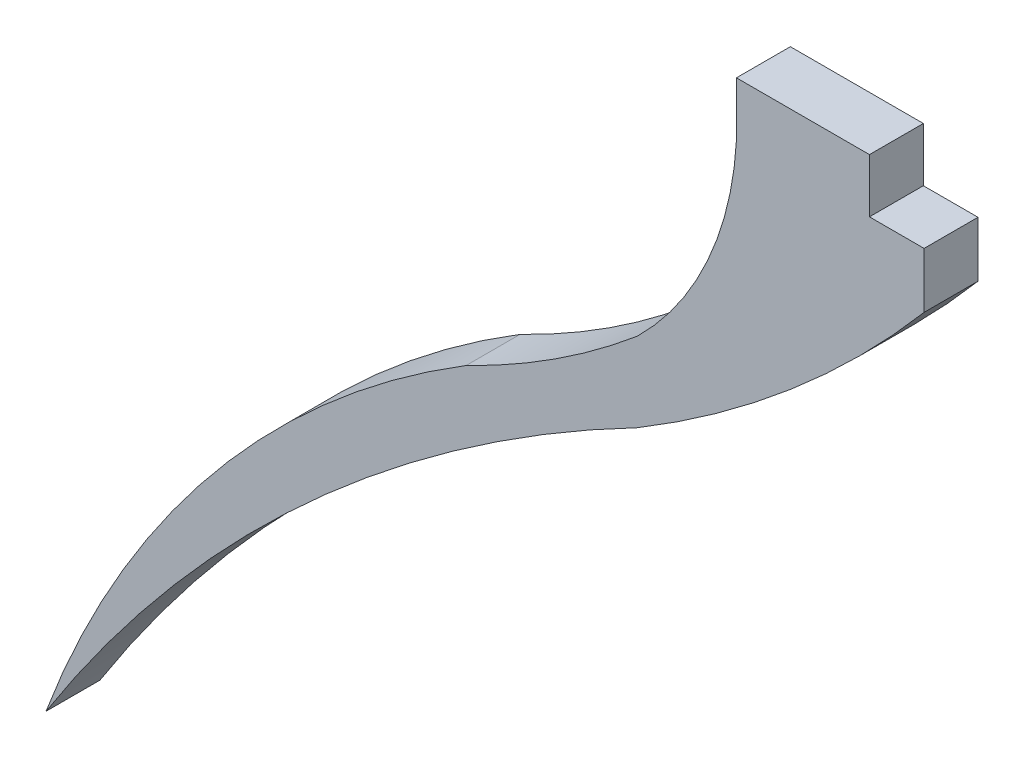
ISO-10303-21;
HEADER;
FILE_DESCRIPTION(('STEP AP214'),'2;1');
FILE_NAME('part.step','',(''),(''),'','','');
FILE_SCHEMA(('AUTOMOTIVE_DESIGN { 1 0 10303 214 1 1 1 1 }'));
ENDSEC;
DATA;
#1=APPLICATION_CONTEXT('core data for automotive mechanical design processes');
#2=APPLICATION_PROTOCOL_DEFINITION('international standard','automotive_design',2000,#1);
#3=PRODUCT_CONTEXT('',#1,'mechanical');
#4=PRODUCT('Part','Part','',(#3));
#5=PRODUCT_RELATED_PRODUCT_CATEGORY('part','',(#4));
#6=PRODUCT_DEFINITION_FORMATION('','',#4);
#7=PRODUCT_DEFINITION_CONTEXT('part definition',#1,'design');
#8=PRODUCT_DEFINITION('design','',#6,#7);
#9=PRODUCT_DEFINITION_SHAPE('','',#8);
#10=(LENGTH_UNIT() NAMED_UNIT(*) SI_UNIT(.MILLI.,.METRE.));
#11=(NAMED_UNIT(*) PLANE_ANGLE_UNIT() SI_UNIT($,.RADIAN.));
#12=(NAMED_UNIT(*) SI_UNIT($,.STERADIAN.) SOLID_ANGLE_UNIT());
#13=UNCERTAINTY_MEASURE_WITH_UNIT(LENGTH_MEASURE(1.E-05),#10,'distance_accuracy_value','');
#14=(GEOMETRIC_REPRESENTATION_CONTEXT(3) GLOBAL_UNCERTAINTY_ASSIGNED_CONTEXT((#13)) GLOBAL_UNIT_ASSIGNED_CONTEXT((#10,
#11,#12)) REPRESENTATION_CONTEXT('',''));
#15=CARTESIAN_POINT('',(0.,0.,0.));
#16=DIRECTION('',(0.,0.,1.));
#17=DIRECTION('',(1.,0.,0.));
#18=AXIS2_PLACEMENT_3D('',#15,#16,#17);
#19=CARTESIAN_POINT('',(-2.25203372430503,1.524,1.524));
#20=DIRECTION('',(0.,-1.,0.));
#21=DIRECTION('',(1.,0.,0.));
#22=AXIS2_PLACEMENT_3D('',#19,#20,#21);
#23=PLANE('',#22);
#24=DIRECTION('',(-1.,0.,0.));
#25=VECTOR('',#24,1.);
#26=CARTESIAN_POINT('',(-2.25203372430503,1.524,0.));
#27=LINE('',#26,#25);
#28=CARTESIAN_POINT('',(1.50795984157009,1.524,0.));
#29=VERTEX_POINT('',#28);
#30=CARTESIAN_POINT('',(-2.25203372430503,1.524,0.));
#31=VERTEX_POINT('',#30);
#32=EDGE_CURVE('E140',#29,#31,#27,.T.);
#33=ORIENTED_EDGE('',*,*,#32,.T.);
#34=DIRECTION('',(0.,0.,-1.));
#35=VECTOR('',#34,1.);
#36=CARTESIAN_POINT('',(-2.25203372430503,1.524,1.524));
#37=LINE('',#36,#35);
#38=CARTESIAN_POINT('',(-2.25203372430503,1.524,1.524));
#39=VERTEX_POINT('',#38);
#40=EDGE_CURVE('E11',#39,#31,#37,.T.);
#41=ORIENTED_EDGE('',*,*,#40,.F.);
#42=DIRECTION('',(-1.,0.,0.));
#43=VECTOR('',#42,1.);
#44=CARTESIAN_POINT('',(-2.25203372430503,1.524,1.524));
#45=LINE('',#44,#43);
#46=CARTESIAN_POINT('',(1.50795984157009,1.524,1.524));
#47=VERTEX_POINT('',#46);
#48=EDGE_CURVE('E158',#47,#39,#45,.T.);
#49=ORIENTED_EDGE('',*,*,#48,.F.);
#50=DIRECTION('',(0.,0.,-1.));
#51=VECTOR('',#50,1.);
#52=CARTESIAN_POINT('',(1.50795984157009,1.524,1.524));
#53=LINE('',#52,#51);
#54=EDGE_CURVE('E136',#47,#29,#53,.T.);
#55=ORIENTED_EDGE('',*,*,#54,.T.);
#56=EDGE_LOOP('',(#33,#41,#49,#55));
#57=FACE_BOUND('',#56,.T.);
#58=ADVANCED_FACE('F32',(#57),#23,.F.);
#59=CARTESIAN_POINT('',(-2.25203372430503,0.,1.524));
#60=DIRECTION('',(1.,0.,0.));
#61=DIRECTION('',(0.,1.,0.));
#62=AXIS2_PLACEMENT_3D('',#59,#60,#61);
#63=PLANE('',#62);
#64=DIRECTION('',(0.,-1.,0.));
#65=VECTOR('',#64,1.);
#66=CARTESIAN_POINT('',(-2.25203372430503,0.,0.));
#67=LINE('',#66,#65);
#68=CARTESIAN_POINT('',(-2.25203372430502,0.,0.));
#69=VERTEX_POINT('',#68);
#70=EDGE_CURVE('E143',#31,#69,#67,.T.);
#71=ORIENTED_EDGE('',*,*,#70,.T.);
#72=DIRECTION('',(0.,0.,-1.));
#73=VECTOR('',#72,1.);
#74=CARTESIAN_POINT('',(-2.25203372430502,0.,1.524));
#75=LINE('',#74,#73);
#76=CARTESIAN_POINT('',(-2.25203372430502,0.,1.524));
#77=VERTEX_POINT('',#76);
#78=EDGE_CURVE('E40',#77,#69,#75,.T.);
#79=ORIENTED_EDGE('',*,*,#78,.F.);
#80=DIRECTION('',(0.,-1.,0.));
#81=VECTOR('',#80,1.);
#82=CARTESIAN_POINT('',(-2.25203372430503,0.,1.524));
#83=LINE('',#82,#81);
#84=EDGE_CURVE('E97',#39,#77,#83,.T.);
#85=ORIENTED_EDGE('',*,*,#84,.F.);
#86=ORIENTED_EDGE('',*,*,#40,.T.);
#87=EDGE_LOOP('',(#71,#79,#85,#86));
#88=FACE_BOUND('',#87,.T.);
#89=ADVANCED_FACE('F207',(#88),#63,.F.);
#90=CARTESIAN_POINT('',(-11.6297715684799,0.501945387016467,1.524));
#91=DIRECTION('',(0.,0.,-1.));
#92=DIRECTION('',(-1.,0.,0.));
#93=AXIS2_PLACEMENT_3D('',#90,#91,#92);
#94=CYLINDRICAL_SURFACE('',#93,9.39116160257166);
#95=CARTESIAN_POINT('',(-11.6297715684799,0.501945387016467,0.));
#96=DIRECTION('',(0.,0.,-1.));
#97=DIRECTION('',(-1.,0.,0.));
#98=AXIS2_PLACEMENT_3D('',#95,#96,#97);
#99=CIRCLE('',#98,9.39116160257166);
#100=CARTESIAN_POINT('',(-5.05366894226105,-6.20244052781974,0.));
#101=VERTEX_POINT('',#100);
#102=EDGE_CURVE('E145',#69,#101,#99,.T.);
#103=ORIENTED_EDGE('',*,*,#102,.T.);
#104=DIRECTION('',(0.,0.,-1.));
#105=VECTOR('',#104,1.);
#106=CARTESIAN_POINT('',(-5.05366894226105,-6.20244052781974,1.524));
#107=LINE('',#106,#105);
#108=CARTESIAN_POINT('',(-5.05366894226105,-6.20244052781974,1.524));
#109=VERTEX_POINT('',#108);
#110=EDGE_CURVE('E171',#109,#101,#107,.T.);
#111=ORIENTED_EDGE('',*,*,#110,.F.);
#112=CARTESIAN_POINT('',(-11.6297715684799,0.501945387016467,1.524));
#113=DIRECTION('',(0.,0.,-1.));
#114=DIRECTION('',(-1.,0.,0.));
#115=AXIS2_PLACEMENT_3D('',#112,#113,#114);
#116=CIRCLE('',#115,9.39116160257166);
#117=EDGE_CURVE('E179',#77,#109,#116,.T.);
#118=ORIENTED_EDGE('',*,*,#117,.F.);
#119=ORIENTED_EDGE('',*,*,#78,.T.);
#120=EDGE_LOOP('',(#103,#111,#118,#119));
#121=FACE_BOUND('',#120,.T.);
#122=ADVANCED_FACE('F177',(#121),#94,.F.);
#123=CARTESIAN_POINT('',(-20.0848571945167,11.6812478956144,1.524));
#124=DIRECTION('',(0.,0.,-1.));
#125=DIRECTION('',(-1.,0.,0.));
#126=AXIS2_PLACEMENT_3D('',#123,#124,#125);
#127=CYLINDRICAL_SURFACE('',#126,23.3615695513213);
#128=CARTESIAN_POINT('',(-20.0848571945167,11.6812478956144,0.));
#129=DIRECTION('',(0.,0.,-1.));
#130=DIRECTION('',(1.,0.,0.));
#131=AXIS2_PLACEMENT_3D('',#128,#129,#130);
#132=CIRCLE('',#131,23.3615695513213);
#133=CARTESIAN_POINT('',(-9.89443503963535,-9.3406033122722,0.));
#134=VERTEX_POINT('',#133);
#135=EDGE_CURVE('E147',#101,#134,#132,.T.);
#136=ORIENTED_EDGE('',*,*,#135,.T.);
#137=DIRECTION('',(0.,0.,-1.));
#138=VECTOR('',#137,1.);
#139=CARTESIAN_POINT('',(-9.89443503963535,-9.3406033122722,1.524));
#140=LINE('',#139,#138);
#141=CARTESIAN_POINT('',(-9.89443503963535,-9.3406033122722,1.524));
#142=VERTEX_POINT('',#141);
#143=EDGE_CURVE('E168',#142,#134,#140,.T.);
#144=ORIENTED_EDGE('',*,*,#143,.F.);
#145=CARTESIAN_POINT('',(-20.0848571945167,11.6812478956144,1.524));
#146=DIRECTION('',(0.,0.,-1.));
#147=DIRECTION('',(1.,0.,0.));
#148=AXIS2_PLACEMENT_3D('',#145,#146,#147);
#149=CIRCLE('',#148,23.3615695513213);
#150=EDGE_CURVE('E197',#109,#142,#149,.T.);
#151=ORIENTED_EDGE('',*,*,#150,.F.);
#152=ORIENTED_EDGE('',*,*,#110,.T.);
#153=EDGE_LOOP('',(#136,#144,#151,#152));
#154=FACE_BOUND('',#153,.T.);
#155=ADVANCED_FACE('F188',(#154),#127,.F.);
#156=CARTESIAN_POINT('',(5.07336505155206,-33.7786165860246,1.524));
#157=DIRECTION('',(0.,0.,-1.));
#158=DIRECTION('',(-1.,0.,0.));
#159=AXIS2_PLACEMENT_3D('',#156,#157,#158);
#160=CYLINDRICAL_SURFACE('',#159,28.6574864972113);
#161=CARTESIAN_POINT('',(5.07336505155206,-33.7786165860246,0.));
#162=DIRECTION('',(0.,0.,1.));
#163=DIRECTION('',(1.,0.,0.));
#164=AXIS2_PLACEMENT_3D('',#161,#162,#163);
#165=CIRCLE('',#164,28.6574864972113);
#166=CARTESIAN_POINT('',(-21.7700318415112,-23.7444960177171,0.));
#167=VERTEX_POINT('',#166);
#168=EDGE_CURVE('E149',#134,#167,#165,.T.);
#169=ORIENTED_EDGE('',*,*,#168,.T.);
#170=DIRECTION('',(0.,0.,-1.));
#171=VECTOR('',#170,1.);
#172=CARTESIAN_POINT('',(-21.7700318415112,-23.7444960177171,1.524));
#173=LINE('',#172,#171);
#174=CARTESIAN_POINT('',(-21.7700318415112,-23.7444960177171,1.524));
#175=VERTEX_POINT('',#174);
#176=EDGE_CURVE('E165',#175,#167,#173,.T.);
#177=ORIENTED_EDGE('',*,*,#176,.F.);
#178=CARTESIAN_POINT('',(5.07336505155206,-33.7786165860246,1.524));
#179=DIRECTION('',(0.,0.,1.));
#180=DIRECTION('',(1.,0.,0.));
#181=AXIS2_PLACEMENT_3D('',#178,#179,#180);
#182=CIRCLE('',#181,28.6574864972113);
#183=EDGE_CURVE('E194',#142,#175,#182,.T.);
#184=ORIENTED_EDGE('',*,*,#183,.F.);
#185=ORIENTED_EDGE('',*,*,#143,.T.);
#186=EDGE_LOOP('',(#169,#177,#184,#185));
#187=FACE_BOUND('',#186,.T.);
#188=ADVANCED_FACE('F192',(#187),#160,.T.);
#189=CARTESIAN_POINT('',(14.8914643357413,-47.0157806423712,1.524));
#190=DIRECTION('',(0.,0.,-1.));
#191=DIRECTION('',(-1.,0.,0.));
#192=AXIS2_PLACEMENT_3D('',#189,#190,#191);
#193=CYLINDRICAL_SURFACE('',#192,43.4237030898605);
#194=CARTESIAN_POINT('',(14.8914643357413,-47.0157806423712,0.));
#195=DIRECTION('',(0.,0.,-1.));
#196=DIRECTION('',(1.,0.,0.));
#197=AXIS2_PLACEMENT_3D('',#194,#195,#196);
#198=CIRCLE('',#197,43.4237030898605);
#199=CARTESIAN_POINT('',(-5.05366894226106,-8.44364499292752,0.));
#200=VERTEX_POINT('',#199);
#201=EDGE_CURVE('E151',#167,#200,#198,.T.);
#202=ORIENTED_EDGE('',*,*,#201,.T.);
#203=DIRECTION('',(0.,0.,-1.));
#204=VECTOR('',#203,1.);
#205=CARTESIAN_POINT('',(-5.05366894226106,-8.44364499292752,1.524));
#206=LINE('',#205,#204);
#207=CARTESIAN_POINT('',(-5.05366894226106,-8.44364499292752,1.524));
#208=VERTEX_POINT('',#207);
#209=EDGE_CURVE('E162',#208,#200,#206,.T.);
#210=ORIENTED_EDGE('',*,*,#209,.F.);
#211=CARTESIAN_POINT('',(14.8914643357413,-47.0157806423712,1.524));
#212=DIRECTION('',(0.,0.,-1.));
#213=DIRECTION('',(1.,0.,0.));
#214=AXIS2_PLACEMENT_3D('',#211,#212,#213);
#215=CIRCLE('',#214,43.4237030898605);
#216=EDGE_CURVE('E196',#175,#208,#215,.T.);
#217=ORIENTED_EDGE('',*,*,#216,.F.);
#218=ORIENTED_EDGE('',*,*,#176,.T.);
#219=EDGE_LOOP('',(#202,#210,#217,#218));
#220=FACE_BOUND('',#219,.T.);
#221=ADVANCED_FACE('F219',(#220),#193,.F.);
#222=CARTESIAN_POINT('',(-21.8570943816426,19.577647323799,1.524));
#223=DIRECTION('',(0.,0.,-1.));
#224=DIRECTION('',(-1.,0.,0.));
#225=AXIS2_PLACEMENT_3D('',#222,#223,#224);
#226=CYLINDRICAL_SURFACE('',#225,32.673351979806);
#227=CARTESIAN_POINT('',(-21.8570943816426,19.577647323799,0.));
#228=DIRECTION('',(0.,0.,1.));
#229=DIRECTION('',(-1.,0.,0.));
#230=AXIS2_PLACEMENT_3D('',#227,#228,#229);
#231=CIRCLE('',#230,32.673351979806);
#232=CARTESIAN_POINT('',(3.05240717719357,-1.56625632918406,0.));
#233=VERTEX_POINT('',#232);
#234=EDGE_CURVE('E153',#200,#233,#231,.T.);
#235=ORIENTED_EDGE('',*,*,#234,.T.);
#236=DIRECTION('',(0.,0.,-1.));
#237=VECTOR('',#236,1.);
#238=CARTESIAN_POINT('',(3.05240717719357,-1.56625632918406,1.524));
#239=LINE('',#238,#237);
#240=CARTESIAN_POINT('',(3.05240717719357,-1.56625632918406,1.524));
#241=VERTEX_POINT('',#240);
#242=EDGE_CURVE('E131',#241,#233,#239,.T.);
#243=ORIENTED_EDGE('',*,*,#242,.F.);
#244=CARTESIAN_POINT('',(-21.8570943816426,19.577647323799,1.524));
#245=DIRECTION('',(0.,0.,1.));
#246=DIRECTION('',(-1.,0.,0.));
#247=AXIS2_PLACEMENT_3D('',#244,#245,#246);
#248=CIRCLE('',#247,32.673351979806);
#249=EDGE_CURVE('E122',#208,#241,#248,.T.);
#250=ORIENTED_EDGE('',*,*,#249,.F.);
#251=ORIENTED_EDGE('',*,*,#209,.T.);
#252=EDGE_LOOP('',(#235,#243,#250,#251));
#253=FACE_BOUND('',#252,.T.);
#254=ADVANCED_FACE('F222',(#253),#226,.T.);
#255=CARTESIAN_POINT('',(3.05240717719357,0.,1.524));
#256=DIRECTION('',(-1.,0.,0.));
#257=DIRECTION('',(0.,0.,1.));
#258=AXIS2_PLACEMENT_3D('',#255,#256,#257);
#259=PLANE('',#258);
#260=DIRECTION('',(0.,1.,0.));
#261=VECTOR('',#260,1.);
#262=CARTESIAN_POINT('',(3.05240717719357,0.,0.));
#263=LINE('',#262,#261);
#264=CARTESIAN_POINT('',(3.05240717719357,0.,0.));
#265=VERTEX_POINT('',#264);
#266=EDGE_CURVE('E130',#233,#265,#263,.T.);
#267=ORIENTED_EDGE('',*,*,#266,.T.);
#268=DIRECTION('',(0.,0.,-1.));
#269=VECTOR('',#268,1.);
#270=CARTESIAN_POINT('',(3.05240717719357,0.,1.524));
#271=LINE('',#270,#269);
#272=CARTESIAN_POINT('',(3.05240717719357,0.,1.524));
#273=VERTEX_POINT('',#272);
#274=EDGE_CURVE('E127',#273,#265,#271,.T.);
#275=ORIENTED_EDGE('',*,*,#274,.F.);
#276=DIRECTION('',(0.,1.,0.));
#277=VECTOR('',#276,1.);
#278=CARTESIAN_POINT('',(3.05240717719357,0.,1.524));
#279=LINE('',#278,#277);
#280=EDGE_CURVE('E116',#241,#273,#279,.T.);
#281=ORIENTED_EDGE('',*,*,#280,.F.);
#282=ORIENTED_EDGE('',*,*,#242,.T.);
#283=EDGE_LOOP('',(#267,#275,#281,#282));
#284=FACE_BOUND('',#283,.T.);
#285=ADVANCED_FACE('F128',(#284),#259,.F.);
#286=CARTESIAN_POINT('',(1.50795984157008,0.,1.524));
#287=DIRECTION('',(0.,-1.,0.));
#288=DIRECTION('',(1.,0.,0.));
#289=AXIS2_PLACEMENT_3D('',#286,#287,#288);
#290=PLANE('',#289);
#291=DIRECTION('',(-1.,0.,0.));
#292=VECTOR('',#291,1.);
#293=CARTESIAN_POINT('',(1.50795984157008,0.,0.));
#294=LINE('',#293,#292);
#295=CARTESIAN_POINT('',(1.50795984157008,0.,0.));
#296=VERTEX_POINT('',#295);
#297=EDGE_CURVE('E83',#265,#296,#294,.T.);
#298=ORIENTED_EDGE('',*,*,#297,.T.);
#299=DIRECTION('',(0.,0.,-1.));
#300=VECTOR('',#299,1.);
#301=CARTESIAN_POINT('',(1.50795984157008,0.,1.524));
#302=LINE('',#301,#300);
#303=CARTESIAN_POINT('',(1.50795984157008,0.,1.524));
#304=VERTEX_POINT('',#303);
#305=EDGE_CURVE('E132',#304,#296,#302,.T.);
#306=ORIENTED_EDGE('',*,*,#305,.F.);
#307=DIRECTION('',(-1.,0.,0.));
#308=VECTOR('',#307,1.);
#309=CARTESIAN_POINT('',(1.50795984157008,0.,1.524));
#310=LINE('',#309,#308);
#311=EDGE_CURVE('E120',#273,#304,#310,.T.);
#312=ORIENTED_EDGE('',*,*,#311,.F.);
#313=ORIENTED_EDGE('',*,*,#274,.T.);
#314=EDGE_LOOP('',(#298,#306,#312,#313));
#315=FACE_BOUND('',#314,.T.);
#316=ADVANCED_FACE('F134',(#315),#290,.F.);
#317=CARTESIAN_POINT('',(1.50795984157009,1.524,1.524));
#318=DIRECTION('',(-1.,0.,0.));
#319=DIRECTION('',(0.,-1.,0.));
#320=AXIS2_PLACEMENT_3D('',#317,#318,#319);
#321=PLANE('',#320);
#322=DIRECTION('',(0.,1.,0.));
#323=VECTOR('',#322,1.);
#324=CARTESIAN_POINT('',(1.50795984157009,1.524,0.));
#325=LINE('',#324,#323);
#326=EDGE_CURVE('E89',#296,#29,#325,.T.);
#327=ORIENTED_EDGE('',*,*,#326,.T.);
#328=ORIENTED_EDGE('',*,*,#54,.F.);
#329=DIRECTION('',(0.,1.,0.));
#330=VECTOR('',#329,1.);
#331=CARTESIAN_POINT('',(1.50795984157009,1.524,1.524));
#332=LINE('',#331,#330);
#333=EDGE_CURVE('E48',#304,#47,#332,.T.);
#334=ORIENTED_EDGE('',*,*,#333,.F.);
#335=ORIENTED_EDGE('',*,*,#305,.T.);
#336=EDGE_LOOP('',(#327,#328,#334,#335));
#337=FACE_BOUND('',#336,.T.);
#338=ADVANCED_FACE('F231',(#337),#321,.F.);
#339=CARTESIAN_POINT('',(-21.8570943816426,19.577647323799,1.524));
#340=DIRECTION('',(0.,0.,-1.));
#341=DIRECTION('',(-1.,0.,0.));
#342=AXIS2_PLACEMENT_3D('',#339,#340,#341);
#343=PLANE('',#342);
#344=ORIENTED_EDGE('',*,*,#48,.T.);
#345=ORIENTED_EDGE('',*,*,#84,.T.);
#346=ORIENTED_EDGE('',*,*,#117,.T.);
#347=ORIENTED_EDGE('',*,*,#150,.T.);
#348=ORIENTED_EDGE('',*,*,#183,.T.);
#349=ORIENTED_EDGE('',*,*,#216,.T.);
#350=ORIENTED_EDGE('',*,*,#249,.T.);
#351=ORIENTED_EDGE('',*,*,#280,.T.);
#352=ORIENTED_EDGE('',*,*,#311,.T.);
#353=ORIENTED_EDGE('',*,*,#333,.T.);
#354=EDGE_LOOP('',(#344,#345,#346,#347,#348,#349,#350,#351,#352,#353));
#355=FACE_BOUND('',#354,.T.);
#356=ADVANCED_FACE('F118',(#355),#343,.F.);
#357=CARTESIAN_POINT('',(-21.8570943816426,19.577647323799,0.));
#358=DIRECTION('',(0.,0.,-1.));
#359=DIRECTION('',(-1.,0.,0.));
#360=AXIS2_PLACEMENT_3D('',#357,#358,#359);
#361=PLANE('',#360);
#362=ORIENTED_EDGE('',*,*,#32,.F.);
#363=ORIENTED_EDGE('',*,*,#326,.F.);
#364=ORIENTED_EDGE('',*,*,#297,.F.);
#365=ORIENTED_EDGE('',*,*,#266,.F.);
#366=ORIENTED_EDGE('',*,*,#234,.F.);
#367=ORIENTED_EDGE('',*,*,#201,.F.);
#368=ORIENTED_EDGE('',*,*,#168,.F.);
#369=ORIENTED_EDGE('',*,*,#135,.F.);
#370=ORIENTED_EDGE('',*,*,#102,.F.);
#371=ORIENTED_EDGE('',*,*,#70,.F.);
#372=EDGE_LOOP('',(#362,#363,#364,#365,#366,#367,#368,#369,#370,#371));
#373=FACE_BOUND('',#372,.T.);
#374=ADVANCED_FACE('F183',(#373),#361,.T.);
#375=CLOSED_SHELL('',(#58,#89,#122,#155,#188,#221,#254,#285,#316,#338,#356,#374));
#376=MANIFOLD_SOLID_BREP('B2',#375);
#377=ADVANCED_BREP_SHAPE_REPRESENTATION('',(#18,#376),#14);
#378=SHAPE_DEFINITION_REPRESENTATION(#9,#377);
ENDSEC;
END-ISO-10303-21;
